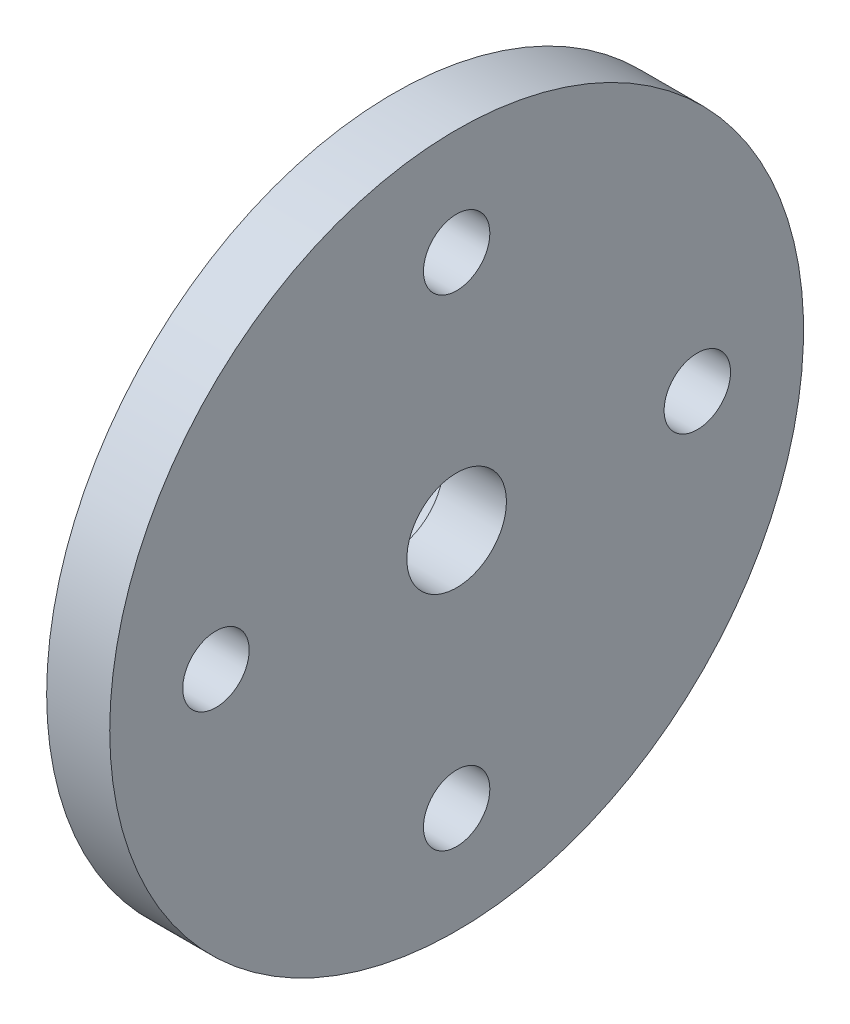
ISO-10303-21;
HEADER;
FILE_DESCRIPTION(('STEP AP214'),'2;1');
FILE_NAME('part.step','',(''),(''),'','','');
FILE_SCHEMA(('AUTOMOTIVE_DESIGN { 1 0 10303 214 1 1 1 1 }'));
ENDSEC;
DATA;
#1=APPLICATION_CONTEXT('core data for automotive mechanical design processes');
#2=APPLICATION_PROTOCOL_DEFINITION('international standard','automotive_design',2000,#1);
#3=PRODUCT_CONTEXT('',#1,'mechanical');
#4=PRODUCT('Part','Part','',(#3));
#5=PRODUCT_RELATED_PRODUCT_CATEGORY('part','',(#4));
#6=PRODUCT_DEFINITION_FORMATION('','',#4);
#7=PRODUCT_DEFINITION_CONTEXT('part definition',#1,'design');
#8=PRODUCT_DEFINITION('design','',#6,#7);
#9=PRODUCT_DEFINITION_SHAPE('','',#8);
#10=(LENGTH_UNIT() NAMED_UNIT(*) SI_UNIT(.MILLI.,.METRE.));
#11=(NAMED_UNIT(*) PLANE_ANGLE_UNIT() SI_UNIT($,.RADIAN.));
#12=(NAMED_UNIT(*) SI_UNIT($,.STERADIAN.) SOLID_ANGLE_UNIT());
#13=UNCERTAINTY_MEASURE_WITH_UNIT(LENGTH_MEASURE(1.E-05),#10,'distance_accuracy_value','');
#14=(GEOMETRIC_REPRESENTATION_CONTEXT(3) GLOBAL_UNCERTAINTY_ASSIGNED_CONTEXT((#13)) GLOBAL_UNIT_ASSIGNED_CONTEXT((#10,
#11,#12)) REPRESENTATION_CONTEXT('',''));
#15=CARTESIAN_POINT('',(0.,0.,0.));
#16=DIRECTION('',(0.,0.,1.));
#17=DIRECTION('',(1.,0.,0.));
#18=AXIS2_PLACEMENT_3D('',#15,#16,#17);
#19=CARTESIAN_POINT('',(0.,0.,0.));
#20=DIRECTION('',(1.,0.,0.));
#21=DIRECTION('',(0.,0.,-1.));
#22=AXIS2_PLACEMENT_3D('',#19,#20,#21);
#23=PLANE('',#22);
#24=CARTESIAN_POINT('',(0.,0.,0.));
#25=DIRECTION('',(1.,0.,0.));
#26=DIRECTION('',(0.,0.,-1.));
#27=AXIS2_PLACEMENT_3D('',#24,#25,#26);
#28=CIRCLE('',#27,4.4);
#29=CARTESIAN_POINT('',(0.,0.,-4.4));
#30=VERTEX_POINT('',#29);
#31=EDGE_CURVE('E35',#30,#30,#28,.T.);
#32=ORIENTED_EDGE('',*,*,#31,.F.);
#33=EDGE_LOOP('',(#32));
#34=FACE_BOUND('',#33,.T.);
#35=CARTESIAN_POINT('',(0.,0.,0.));
#36=DIRECTION('',(1.,0.,0.));
#37=DIRECTION('',(0.,0.,-1.));
#38=AXIS2_PLACEMENT_3D('',#35,#36,#37);
#39=CIRCLE('',#38,3.);
#40=CARTESIAN_POINT('',(0.,0.,-3.));
#41=VERTEX_POINT('',#40);
#42=EDGE_CURVE('E42',#41,#41,#39,.T.);
#43=ORIENTED_EDGE('',*,*,#42,.T.);
#44=EDGE_LOOP('',(#43));
#45=FACE_BOUND('',#44,.T.);
#46=ADVANCED_FACE('F31',(#34,#45),#23,.F.);
#47=CARTESIAN_POINT('',(3.5,0.,0.));
#48=DIRECTION('',(-1.,0.,0.));
#49=DIRECTION('',(0.,0.,1.));
#50=AXIS2_PLACEMENT_3D('',#47,#48,#49);
#51=CYLINDRICAL_SURFACE('',#50,4.4);
#52=CARTESIAN_POINT('',(3.5,0.,0.));
#53=DIRECTION('',(1.,0.,0.));
#54=DIRECTION('',(0.,0.,-1.));
#55=AXIS2_PLACEMENT_3D('',#52,#53,#54);
#56=CIRCLE('',#55,4.4);
#57=CARTESIAN_POINT('',(3.5,0.,-4.4));
#58=VERTEX_POINT('',#57);
#59=EDGE_CURVE('E10',#58,#58,#56,.T.);
#60=ORIENTED_EDGE('',*,*,#59,.F.);
#61=EDGE_LOOP('',(#60));
#62=FACE_BOUND('',#61,.T.);
#63=ORIENTED_EDGE('',*,*,#31,.T.);
#64=EDGE_LOOP('',(#63));
#65=FACE_BOUND('',#64,.T.);
#66=ADVANCED_FACE('F33',(#62,#65),#51,.T.);
#67=CARTESIAN_POINT('',(3.5,0.,0.));
#68=DIRECTION('',(-1.,0.,0.));
#69=DIRECTION('',(0.,0.,1.));
#70=AXIS2_PLACEMENT_3D('',#67,#68,#69);
#71=CYLINDRICAL_SURFACE('',#70,3.);
#72=CARTESIAN_POINT('',(3.5,0.,0.));
#73=DIRECTION('',(1.,0.,0.));
#74=DIRECTION('',(0.,0.,-1.));
#75=AXIS2_PLACEMENT_3D('',#72,#73,#74);
#76=CIRCLE('',#75,3.);
#77=CARTESIAN_POINT('',(3.5,0.,-3.));
#78=VERTEX_POINT('',#77);
#79=EDGE_CURVE('E46',#78,#78,#76,.T.);
#80=ORIENTED_EDGE('',*,*,#79,.T.);
#81=EDGE_LOOP('',(#80));
#82=FACE_BOUND('',#81,.T.);
#83=ORIENTED_EDGE('',*,*,#42,.F.);
#84=EDGE_LOOP('',(#83));
#85=FACE_BOUND('',#84,.T.);
#86=ADVANCED_FACE('F118',(#82,#85),#71,.F.);
#87=CARTESIAN_POINT('',(3.5,0.,0.));
#88=DIRECTION('',(1.,0.,0.));
#89=DIRECTION('',(0.,0.,-1.));
#90=AXIS2_PLACEMENT_3D('',#87,#88,#89);
#91=PLANE('',#90);
#92=CARTESIAN_POINT('',(3.5,0.,0.));
#93=DIRECTION('',(1.,0.,0.));
#94=DIRECTION('',(0.,0.,-1.));
#95=AXIS2_PLACEMENT_3D('',#92,#93,#94);
#96=CIRCLE('',#95,1.5);
#97=CARTESIAN_POINT('',(3.5,0.,-1.5));
#98=VERTEX_POINT('',#97);
#99=EDGE_CURVE('E53',#98,#98,#96,.T.);
#100=ORIENTED_EDGE('',*,*,#99,.T.);
#101=EDGE_LOOP('',(#100));
#102=FACE_BOUND('',#101,.T.);
#103=ORIENTED_EDGE('',*,*,#79,.F.);
#104=EDGE_LOOP('',(#103));
#105=FACE_BOUND('',#104,.T.);
#106=ADVANCED_FACE('F112',(#102,#105),#91,.F.);
#107=CARTESIAN_POINT('',(3.5,-2.06057393370429E-13,7.2499999999998));
#108=DIRECTION('',(1.,0.,0.));
#109=DIRECTION('',(0.,0.,-1.));
#110=AXIS2_PLACEMENT_3D('',#107,#108,#109);
#111=CIRCLE('',#110,1.00000000000033);
#112=CARTESIAN_POINT('',(3.5,-2.06057393370429E-13,6.24999999999947));
#113=VERTEX_POINT('',#112);
#114=EDGE_CURVE('E79',#113,#113,#111,.T.);
#115=ORIENTED_EDGE('',*,*,#114,.T.);
#116=EDGE_LOOP('',(#115));
#117=FACE_BOUND('',#116,.T.);
#118=CARTESIAN_POINT('',(3.5,-7.25,-4.10339048882094E-13));
#119=DIRECTION('',(1.,0.,0.));
#120=DIRECTION('',(0.,0.,-1.));
#121=AXIS2_PLACEMENT_3D('',#118,#119,#120);
#122=CIRCLE('',#121,1.00000000000044);
#123=CARTESIAN_POINT('',(3.5,-7.25,-1.00000000000085));
#124=VERTEX_POINT('',#123);
#125=EDGE_CURVE('E73',#124,#124,#122,.T.);
#126=ORIENTED_EDGE('',*,*,#125,.T.);
#127=EDGE_LOOP('',(#126));
#128=FACE_BOUND('',#127,.T.);
#129=CARTESIAN_POINT('',(3.5,2.05169524441047E-13,-7.25000000000021));
#130=DIRECTION('',(1.,0.,0.));
#131=DIRECTION('',(0.,0.,-1.));
#132=AXIS2_PLACEMENT_3D('',#129,#130,#131);
#133=CIRCLE('',#132,1.00000000000016);
#134=CARTESIAN_POINT('',(3.5,2.05169524441047E-13,-8.25000000000037));
#135=VERTEX_POINT('',#134);
#136=EDGE_CURVE('E67',#135,#135,#133,.T.);
#137=ORIENTED_EDGE('',*,*,#136,.T.);
#138=EDGE_LOOP('',(#137));
#139=FACE_BOUND('',#138,.T.);
#140=CARTESIAN_POINT('',(3.5,7.25,0.));
#141=DIRECTION('',(1.,0.,0.));
#142=DIRECTION('',(0.,0.,-1.));
#143=AXIS2_PLACEMENT_3D('',#140,#141,#142);
#144=CIRCLE('',#143,1.);
#145=CARTESIAN_POINT('',(3.5,7.25,-1.));
#146=VERTEX_POINT('',#145);
#147=EDGE_CURVE('E59',#146,#146,#144,.T.);
#148=ORIENTED_EDGE('',*,*,#147,.T.);
#149=EDGE_LOOP('',(#148));
#150=FACE_BOUND('',#149,.T.);
#151=CARTESIAN_POINT('',(3.5,0.,0.));
#152=DIRECTION('',(1.,0.,0.));
#153=DIRECTION('',(0.,0.,-1.));
#154=AXIS2_PLACEMENT_3D('',#151,#152,#153);
#155=CIRCLE('',#154,10.45);
#156=CARTESIAN_POINT('',(3.5,0.,10.45));
#157=VERTEX_POINT('',#156);
#158=EDGE_CURVE('E50',#157,#157,#155,.T.);
#159=ORIENTED_EDGE('',*,*,#158,.F.);
#160=EDGE_LOOP('',(#159));
#161=FACE_BOUND('',#160,.T.);
#162=ORIENTED_EDGE('',*,*,#59,.T.);
#163=EDGE_LOOP('',(#162));
#164=FACE_BOUND('',#163,.T.);
#165=ADVANCED_FACE('F107',(#117,#128,#139,#150,#161,#164),#91,.F.);
#166=CARTESIAN_POINT('',(5.4,0.,0.));
#167=DIRECTION('',(-1.,0.,0.));
#168=DIRECTION('',(0.,0.,1.));
#169=AXIS2_PLACEMENT_3D('',#166,#167,#168);
#170=CYLINDRICAL_SURFACE('',#169,10.45);
#171=CARTESIAN_POINT('',(5.4,0.,0.));
#172=DIRECTION('',(1.,0.,0.));
#173=DIRECTION('',(0.,0.,-1.));
#174=AXIS2_PLACEMENT_3D('',#171,#172,#173);
#175=CIRCLE('',#174,10.45);
#176=CARTESIAN_POINT('',(5.4,0.,10.45));
#177=VERTEX_POINT('',#176);
#178=EDGE_CURVE('E49',#177,#177,#175,.T.);
#179=CARTESIAN_POINT('',(5.4,0.,10.45));
#180=CARTESIAN_POINT('',(5.38020833333333,0.,10.45));
#181=CARTESIAN_POINT('',(5.36041666666667,0.,10.45));
#182=CARTESIAN_POINT('',(5.32083333333333,0.,10.45));
#183=CARTESIAN_POINT('',(5.30104166666667,0.,10.45));
#184=CARTESIAN_POINT('',(5.26145833333333,0.,10.45));
#185=CARTESIAN_POINT('',(5.24166666666667,0.,10.45));
#186=CARTESIAN_POINT('',(5.20208333333333,0.,10.45));
#187=CARTESIAN_POINT('',(5.18229166666667,0.,10.45));
#188=CARTESIAN_POINT('',(5.14270833333333,0.,10.45));
#189=CARTESIAN_POINT('',(5.12291666666667,0.,10.45));
#190=CARTESIAN_POINT('',(5.08333333333333,0.,10.45));
#191=CARTESIAN_POINT('',(5.06354166666667,0.,10.45));
#192=CARTESIAN_POINT('',(5.02395833333333,0.,10.45));
#193=CARTESIAN_POINT('',(5.00416666666667,0.,10.45));
#194=CARTESIAN_POINT('',(4.96458333333333,0.,10.45));
#195=CARTESIAN_POINT('',(4.94479166666667,0.,10.45));
#196=CARTESIAN_POINT('',(4.90520833333333,0.,10.45));
#197=CARTESIAN_POINT('',(4.88541666666667,0.,10.45));
#198=CARTESIAN_POINT('',(4.84583333333333,0.,10.45));
#199=CARTESIAN_POINT('',(4.82604166666667,0.,10.45));
#200=CARTESIAN_POINT('',(4.78645833333333,0.,10.45));
#201=CARTESIAN_POINT('',(4.76666666666667,0.,10.45));
#202=CARTESIAN_POINT('',(4.72708333333333,0.,10.45));
#203=CARTESIAN_POINT('',(4.70729166666667,0.,10.45));
#204=CARTESIAN_POINT('',(4.66770833333333,0.,10.45));
#205=CARTESIAN_POINT('',(4.64791666666667,0.,10.45));
#206=CARTESIAN_POINT('',(4.60833333333333,0.,10.45));
#207=CARTESIAN_POINT('',(4.58854166666667,0.,10.45));
#208=CARTESIAN_POINT('',(4.54895833333333,0.,10.45));
#209=CARTESIAN_POINT('',(4.52916666666667,0.,10.45));
#210=CARTESIAN_POINT('',(4.48958333333333,0.,10.45));
#211=CARTESIAN_POINT('',(4.46979166666667,0.,10.45));
#212=CARTESIAN_POINT('',(4.43020833333333,0.,10.45));
#213=CARTESIAN_POINT('',(4.41041666666667,0.,10.45));
#214=CARTESIAN_POINT('',(4.37083333333333,0.,10.45));
#215=CARTESIAN_POINT('',(4.35104166666667,0.,10.45));
#216=CARTESIAN_POINT('',(4.31145833333333,0.,10.45));
#217=CARTESIAN_POINT('',(4.29166666666667,0.,10.45));
#218=CARTESIAN_POINT('',(4.25208333333333,0.,10.45));
#219=CARTESIAN_POINT('',(4.23229166666667,0.,10.45));
#220=CARTESIAN_POINT('',(4.19270833333333,0.,10.45));
#221=CARTESIAN_POINT('',(4.17291666666667,0.,10.45));
#222=CARTESIAN_POINT('',(4.13333333333333,0.,10.45));
#223=CARTESIAN_POINT('',(4.11354166666667,0.,10.45));
#224=CARTESIAN_POINT('',(4.07395833333333,0.,10.45));
#225=CARTESIAN_POINT('',(4.05416666666667,0.,10.45));
#226=CARTESIAN_POINT('',(4.01458333333333,0.,10.45));
#227=CARTESIAN_POINT('',(3.99479166666667,0.,10.45));
#228=CARTESIAN_POINT('',(3.95520833333333,0.,10.45));
#229=CARTESIAN_POINT('',(3.93541666666667,0.,10.45));
#230=CARTESIAN_POINT('',(3.89583333333333,0.,10.45));
#231=CARTESIAN_POINT('',(3.87604166666667,0.,10.45));
#232=CARTESIAN_POINT('',(3.83645833333333,0.,10.45));
#233=CARTESIAN_POINT('',(3.81666666666667,0.,10.45));
#234=CARTESIAN_POINT('',(3.77708333333333,0.,10.45));
#235=CARTESIAN_POINT('',(3.75729166666667,0.,10.45));
#236=CARTESIAN_POINT('',(3.71770833333333,0.,10.45));
#237=CARTESIAN_POINT('',(3.69791666666667,0.,10.45));
#238=CARTESIAN_POINT('',(3.65833333333333,0.,10.45));
#239=CARTESIAN_POINT('',(3.63854166666667,0.,10.45));
#240=CARTESIAN_POINT('',(3.59895833333333,0.,10.45));
#241=CARTESIAN_POINT('',(3.57916666666667,0.,10.45));
#242=CARTESIAN_POINT('',(3.53958333333333,0.,10.45));
#243=CARTESIAN_POINT('',(3.51979166666667,0.,10.45));
#244=CARTESIAN_POINT('',(3.5,0.,10.45));
#245=B_SPLINE_CURVE_WITH_KNOTS('',3,(#179,#180,#181,#182,#183,#184,#185,#186,#187,#188,#189,
#190,#191,#192,#193,#194,#195,#196,#197,#198,#199,#200,#201,#202,#203,#204,#205,#206,#207,#208,
#209,#210,#211,#212,#213,#214,#215,#216,#217,#218,#219,#220,#221,#222,#223,#224,#225,#226,#227,
#228,#229,#230,#231,#232,#233,#234,#235,#236,#237,#238,#239,#240,#241,#242,#243,#244),
.UNSPECIFIED.,.F.,.F.,(4,2,2,2,2,2,2,2,2,2,2,2,2,2,2,2,2,2,2,2,2,2,2,2,2,2,2,2,2,2,2,2,4),(0.,
0.0593750000000004,0.118750000000001,0.178125,0.237500000000001,0.296875,0.356250000000001,
0.415625,0.475000000000001,0.534375,0.593750000000001,0.653125,0.7125,0.771875,0.83125,
0.890625000000001,0.95,1.009375,1.06875,1.128125,1.1875,1.246875,1.30625,1.365625,1.425,
1.484375,1.54375,1.603125,1.6625,1.721875,1.78125,1.840625,1.9),.UNSPECIFIED.);
#246=EDGE_CURVE('BSEAM93',#177,#157,#245,.T.);
#247=ORIENTED_EDGE('',*,*,#178,.F.);
#248=ORIENTED_EDGE('',*,*,#158,.T.);
#249=ORIENTED_EDGE('',*,*,#246,.T.);
#250=ORIENTED_EDGE('',*,*,#246,.F.);
#251=EDGE_LOOP('',(#247,#249,#248,#250));
#252=FACE_BOUND('',#251,.T.);
#253=ADVANCED_FACE('F93',(#252),#170,.T.);
#254=CARTESIAN_POINT('',(5.4,0.,0.));
#255=DIRECTION('',(1.,0.,0.));
#256=DIRECTION('',(0.,0.,-1.));
#257=AXIS2_PLACEMENT_3D('',#254,#255,#256);
#258=PLANE('',#257);
#259=CARTESIAN_POINT('',(5.4,-2.06057393370429E-13,7.2499999999998));
#260=DIRECTION('',(1.,0.,0.));
#261=DIRECTION('',(0.,0.,-1.));
#262=AXIS2_PLACEMENT_3D('',#259,#260,#261);
#263=CIRCLE('',#262,1.00000000000033);
#264=CARTESIAN_POINT('',(5.4,-2.06057393370429E-13,6.24999999999947));
#265=VERTEX_POINT('',#264);
#266=EDGE_CURVE('E82',#265,#265,#263,.T.);
#267=ORIENTED_EDGE('',*,*,#266,.F.);
#268=EDGE_LOOP('',(#267));
#269=FACE_BOUND('',#268,.T.);
#270=CARTESIAN_POINT('',(5.4,-7.25,-4.10339048882094E-13));
#271=DIRECTION('',(1.,0.,0.));
#272=DIRECTION('',(0.,0.,-1.));
#273=AXIS2_PLACEMENT_3D('',#270,#271,#272);
#274=CIRCLE('',#273,1.00000000000044);
#275=CARTESIAN_POINT('',(5.4,-7.25,-1.00000000000085));
#276=VERTEX_POINT('',#275);
#277=EDGE_CURVE('E76',#276,#276,#274,.T.);
#278=ORIENTED_EDGE('',*,*,#277,.F.);
#279=EDGE_LOOP('',(#278));
#280=FACE_BOUND('',#279,.T.);
#281=CARTESIAN_POINT('',(5.4,2.05169524441047E-13,-7.25000000000021));
#282=DIRECTION('',(1.,0.,0.));
#283=DIRECTION('',(0.,0.,-1.));
#284=AXIS2_PLACEMENT_3D('',#281,#282,#283);
#285=CIRCLE('',#284,1.00000000000016);
#286=CARTESIAN_POINT('',(5.4,2.05169524441047E-13,-8.25000000000037));
#287=VERTEX_POINT('',#286);
#288=EDGE_CURVE('E70',#287,#287,#285,.T.);
#289=ORIENTED_EDGE('',*,*,#288,.F.);
#290=EDGE_LOOP('',(#289));
#291=FACE_BOUND('',#290,.T.);
#292=CARTESIAN_POINT('',(5.4,7.25,0.));
#293=DIRECTION('',(1.,0.,0.));
#294=DIRECTION('',(0.,0.,-1.));
#295=AXIS2_PLACEMENT_3D('',#292,#293,#294);
#296=CIRCLE('',#295,1.);
#297=CARTESIAN_POINT('',(5.4,7.25,-1.));
#298=VERTEX_POINT('',#297);
#299=EDGE_CURVE('E64',#298,#298,#296,.T.);
#300=ORIENTED_EDGE('',*,*,#299,.F.);
#301=EDGE_LOOP('',(#300));
#302=FACE_BOUND('',#301,.T.);
#303=CARTESIAN_POINT('',(5.4,0.,0.));
#304=DIRECTION('',(1.,0.,0.));
#305=DIRECTION('',(0.,0.,-1.));
#306=AXIS2_PLACEMENT_3D('',#303,#304,#305);
#307=CIRCLE('',#306,1.5);
#308=CARTESIAN_POINT('',(5.4,0.,-1.5));
#309=VERTEX_POINT('',#308);
#310=EDGE_CURVE('E56',#309,#309,#307,.T.);
#311=ORIENTED_EDGE('',*,*,#310,.F.);
#312=EDGE_LOOP('',(#311));
#313=FACE_BOUND('',#312,.T.);
#314=ORIENTED_EDGE('',*,*,#178,.T.);
#315=EDGE_LOOP('',(#314));
#316=FACE_BOUND('',#315,.T.);
#317=ADVANCED_FACE('F89',(#269,#280,#291,#302,#313,#316),#258,.T.);
#318=CARTESIAN_POINT('',(3.5,0.,0.));
#319=DIRECTION('',(1.,0.,0.));
#320=DIRECTION('',(0.,0.,-1.));
#321=AXIS2_PLACEMENT_3D('',#318,#319,#320);
#322=CYLINDRICAL_SURFACE('',#321,1.5);
#323=CARTESIAN_POINT('',(3.5,0.,-1.5));
#324=CARTESIAN_POINT('',(3.51979166666667,0.,-1.5));
#325=CARTESIAN_POINT('',(3.53958333333333,0.,-1.5));
#326=CARTESIAN_POINT('',(3.57916666666667,0.,-1.5));
#327=CARTESIAN_POINT('',(3.59895833333333,0.,-1.5));
#328=CARTESIAN_POINT('',(3.63854166666667,0.,-1.5));
#329=CARTESIAN_POINT('',(3.65833333333333,0.,-1.5));
#330=CARTESIAN_POINT('',(3.69791666666667,0.,-1.5));
#331=CARTESIAN_POINT('',(3.71770833333333,0.,-1.5));
#332=CARTESIAN_POINT('',(3.75729166666667,0.,-1.5));
#333=CARTESIAN_POINT('',(3.77708333333333,0.,-1.5));
#334=CARTESIAN_POINT('',(3.81666666666667,0.,-1.5));
#335=CARTESIAN_POINT('',(3.83645833333333,0.,-1.5));
#336=CARTESIAN_POINT('',(3.87604166666667,0.,-1.5));
#337=CARTESIAN_POINT('',(3.89583333333333,0.,-1.5));
#338=CARTESIAN_POINT('',(3.93541666666667,0.,-1.5));
#339=CARTESIAN_POINT('',(3.95520833333333,0.,-1.5));
#340=CARTESIAN_POINT('',(3.99479166666667,0.,-1.5));
#341=CARTESIAN_POINT('',(4.01458333333333,0.,-1.5));
#342=CARTESIAN_POINT('',(4.05416666666667,0.,-1.5));
#343=CARTESIAN_POINT('',(4.07395833333333,0.,-1.5));
#344=CARTESIAN_POINT('',(4.11354166666667,0.,-1.5));
#345=CARTESIAN_POINT('',(4.13333333333333,0.,-1.5));
#346=CARTESIAN_POINT('',(4.17291666666667,0.,-1.5));
#347=CARTESIAN_POINT('',(4.19270833333333,0.,-1.5));
#348=CARTESIAN_POINT('',(4.23229166666667,0.,-1.5));
#349=CARTESIAN_POINT('',(4.25208333333333,0.,-1.5));
#350=CARTESIAN_POINT('',(4.29166666666667,0.,-1.5));
#351=CARTESIAN_POINT('',(4.31145833333333,0.,-1.5));
#352=CARTESIAN_POINT('',(4.35104166666667,0.,-1.5));
#353=CARTESIAN_POINT('',(4.37083333333333,0.,-1.5));
#354=CARTESIAN_POINT('',(4.41041666666667,0.,-1.5));
#355=CARTESIAN_POINT('',(4.43020833333333,0.,-1.5));
#356=CARTESIAN_POINT('',(4.46979166666667,0.,-1.5));
#357=CARTESIAN_POINT('',(4.48958333333333,0.,-1.5));
#358=CARTESIAN_POINT('',(4.52916666666667,0.,-1.5));
#359=CARTESIAN_POINT('',(4.54895833333333,0.,-1.5));
#360=CARTESIAN_POINT('',(4.58854166666667,0.,-1.5));
#361=CARTESIAN_POINT('',(4.60833333333333,0.,-1.5));
#362=CARTESIAN_POINT('',(4.64791666666667,0.,-1.5));
#363=CARTESIAN_POINT('',(4.66770833333333,0.,-1.5));
#364=CARTESIAN_POINT('',(4.70729166666667,0.,-1.5));
#365=CARTESIAN_POINT('',(4.72708333333333,0.,-1.5));
#366=CARTESIAN_POINT('',(4.76666666666667,0.,-1.5));
#367=CARTESIAN_POINT('',(4.78645833333333,0.,-1.5));
#368=CARTESIAN_POINT('',(4.82604166666667,0.,-1.5));
#369=CARTESIAN_POINT('',(4.84583333333333,0.,-1.5));
#370=CARTESIAN_POINT('',(4.88541666666667,0.,-1.5));
#371=CARTESIAN_POINT('',(4.90520833333333,0.,-1.5));
#372=CARTESIAN_POINT('',(4.94479166666667,0.,-1.5));
#373=CARTESIAN_POINT('',(4.96458333333333,0.,-1.5));
#374=CARTESIAN_POINT('',(5.00416666666667,0.,-1.5));
#375=CARTESIAN_POINT('',(5.02395833333333,0.,-1.5));
#376=CARTESIAN_POINT('',(5.06354166666667,0.,-1.5));
#377=CARTESIAN_POINT('',(5.08333333333333,0.,-1.5));
#378=CARTESIAN_POINT('',(5.12291666666667,0.,-1.5));
#379=CARTESIAN_POINT('',(5.14270833333333,0.,-1.5));
#380=CARTESIAN_POINT('',(5.18229166666667,0.,-1.5));
#381=CARTESIAN_POINT('',(5.20208333333333,0.,-1.5));
#382=CARTESIAN_POINT('',(5.24166666666667,0.,-1.5));
#383=CARTESIAN_POINT('',(5.26145833333333,0.,-1.5));
#384=CARTESIAN_POINT('',(5.30104166666667,0.,-1.5));
#385=CARTESIAN_POINT('',(5.32083333333333,0.,-1.5));
#386=CARTESIAN_POINT('',(5.36041666666667,0.,-1.5));
#387=CARTESIAN_POINT('',(5.38020833333333,0.,-1.5));
#388=CARTESIAN_POINT('',(5.4,0.,-1.5));
#389=B_SPLINE_CURVE_WITH_KNOTS('',3,(#323,#324,#325,#326,#327,#328,#329,#330,#331,#332,#333,
#334,#335,#336,#337,#338,#339,#340,#341,#342,#343,#344,#345,#346,#347,#348,#349,#350,#351,#352,
#353,#354,#355,#356,#357,#358,#359,#360,#361,#362,#363,#364,#365,#366,#367,#368,#369,#370,#371,
#372,#373,#374,#375,#376,#377,#378,#379,#380,#381,#382,#383,#384,#385,#386,#387,#388),
.UNSPECIFIED.,.F.,.F.,(4,2,2,2,2,2,2,2,2,2,2,2,2,2,2,2,2,2,2,2,2,2,2,2,2,2,2,2,2,2,2,2,4),(0.,
0.059375,0.11875,0.178125,0.2375,0.296875,0.35625,0.415624999999999,0.475,0.534374999999999,
0.59375,0.653124999999999,0.7125,0.771874999999999,0.831249999999999,0.890625,0.95,1.009375,
1.06875,1.128125,1.1875,1.246875,1.30625,1.365625,1.425,1.484375,1.54375,1.603125,1.6625,
1.721875,1.78125,1.840625,1.9),.UNSPECIFIED.);
#390=EDGE_CURVE('BSEAM92',#98,#309,#389,.T.);
#391=ORIENTED_EDGE('',*,*,#99,.F.);
#392=ORIENTED_EDGE('',*,*,#310,.T.);
#393=ORIENTED_EDGE('',*,*,#390,.T.);
#394=ORIENTED_EDGE('',*,*,#390,.F.);
#395=EDGE_LOOP('',(#391,#393,#392,#394));
#396=FACE_BOUND('',#395,.T.);
#397=ADVANCED_FACE('F92',(#396),#322,.F.);
#398=CARTESIAN_POINT('',(0.,7.25,0.));
#399=DIRECTION('',(1.,0.,0.));
#400=DIRECTION('',(0.,0.,-1.));
#401=AXIS2_PLACEMENT_3D('',#398,#399,#400);
#402=CYLINDRICAL_SURFACE('',#401,1.);
#403=CARTESIAN_POINT('',(5.4,7.25,-1.));
#404=CARTESIAN_POINT('',(5.38020833333333,7.25,-1.));
#405=CARTESIAN_POINT('',(5.36041666666667,7.25,-1.));
#406=CARTESIAN_POINT('',(5.32083333333333,7.25,-1.));
#407=CARTESIAN_POINT('',(5.30104166666667,7.25,-1.));
#408=CARTESIAN_POINT('',(5.26145833333333,7.25,-1.));
#409=CARTESIAN_POINT('',(5.24166666666667,7.25,-1.));
#410=CARTESIAN_POINT('',(5.20208333333333,7.25,-1.));
#411=CARTESIAN_POINT('',(5.18229166666667,7.25,-1.));
#412=CARTESIAN_POINT('',(5.14270833333333,7.25,-1.));
#413=CARTESIAN_POINT('',(5.12291666666667,7.25,-1.));
#414=CARTESIAN_POINT('',(5.08333333333333,7.25,-1.));
#415=CARTESIAN_POINT('',(5.06354166666667,7.25,-1.));
#416=CARTESIAN_POINT('',(5.02395833333333,7.25,-1.));
#417=CARTESIAN_POINT('',(5.00416666666667,7.25,-1.));
#418=CARTESIAN_POINT('',(4.96458333333333,7.25,-1.));
#419=CARTESIAN_POINT('',(4.94479166666667,7.25,-1.));
#420=CARTESIAN_POINT('',(4.90520833333333,7.25,-1.));
#421=CARTESIAN_POINT('',(4.88541666666667,7.25,-1.));
#422=CARTESIAN_POINT('',(4.84583333333333,7.25,-1.));
#423=CARTESIAN_POINT('',(4.82604166666667,7.25,-1.));
#424=CARTESIAN_POINT('',(4.78645833333333,7.25,-1.));
#425=CARTESIAN_POINT('',(4.76666666666667,7.25,-1.));
#426=CARTESIAN_POINT('',(4.72708333333333,7.25,-1.));
#427=CARTESIAN_POINT('',(4.70729166666667,7.25,-1.));
#428=CARTESIAN_POINT('',(4.66770833333333,7.25,-1.));
#429=CARTESIAN_POINT('',(4.64791666666667,7.25,-1.));
#430=CARTESIAN_POINT('',(4.60833333333333,7.25,-1.));
#431=CARTESIAN_POINT('',(4.58854166666667,7.25,-1.));
#432=CARTESIAN_POINT('',(4.54895833333333,7.25,-1.));
#433=CARTESIAN_POINT('',(4.52916666666667,7.25,-1.));
#434=CARTESIAN_POINT('',(4.48958333333333,7.25,-1.));
#435=CARTESIAN_POINT('',(4.46979166666667,7.25,-1.));
#436=CARTESIAN_POINT('',(4.43020833333333,7.25,-1.));
#437=CARTESIAN_POINT('',(4.41041666666667,7.25,-1.));
#438=CARTESIAN_POINT('',(4.37083333333333,7.25,-1.));
#439=CARTESIAN_POINT('',(4.35104166666667,7.25,-1.));
#440=CARTESIAN_POINT('',(4.31145833333333,7.25,-1.));
#441=CARTESIAN_POINT('',(4.29166666666667,7.25,-1.));
#442=CARTESIAN_POINT('',(4.25208333333333,7.25,-1.));
#443=CARTESIAN_POINT('',(4.23229166666667,7.25,-1.));
#444=CARTESIAN_POINT('',(4.19270833333333,7.25,-1.));
#445=CARTESIAN_POINT('',(4.17291666666667,7.25,-1.));
#446=CARTESIAN_POINT('',(4.13333333333333,7.25,-1.));
#447=CARTESIAN_POINT('',(4.11354166666667,7.25,-1.));
#448=CARTESIAN_POINT('',(4.07395833333333,7.25,-1.));
#449=CARTESIAN_POINT('',(4.05416666666667,7.25,-1.));
#450=CARTESIAN_POINT('',(4.01458333333333,7.25,-1.));
#451=CARTESIAN_POINT('',(3.99479166666667,7.25,-1.));
#452=CARTESIAN_POINT('',(3.95520833333333,7.25,-1.));
#453=CARTESIAN_POINT('',(3.93541666666667,7.25,-1.));
#454=CARTESIAN_POINT('',(3.89583333333333,7.25,-1.));
#455=CARTESIAN_POINT('',(3.87604166666667,7.25,-1.));
#456=CARTESIAN_POINT('',(3.83645833333333,7.25,-1.));
#457=CARTESIAN_POINT('',(3.81666666666667,7.25,-1.));
#458=CARTESIAN_POINT('',(3.77708333333333,7.25,-1.));
#459=CARTESIAN_POINT('',(3.75729166666667,7.25,-1.));
#460=CARTESIAN_POINT('',(3.71770833333333,7.25,-1.));
#461=CARTESIAN_POINT('',(3.69791666666667,7.25,-1.));
#462=CARTESIAN_POINT('',(3.65833333333333,7.25,-1.));
#463=CARTESIAN_POINT('',(3.63854166666667,7.25,-1.));
#464=CARTESIAN_POINT('',(3.59895833333333,7.25,-1.));
#465=CARTESIAN_POINT('',(3.57916666666667,7.25,-1.));
#466=CARTESIAN_POINT('',(3.53958333333333,7.25,-1.));
#467=CARTESIAN_POINT('',(3.51979166666667,7.25,-1.));
#468=CARTESIAN_POINT('',(3.5,7.25,-1.));
#469=B_SPLINE_CURVE_WITH_KNOTS('',3,(#403,#404,#405,#406,#407,#408,#409,#410,#411,#412,#413,
#414,#415,#416,#417,#418,#419,#420,#421,#422,#423,#424,#425,#426,#427,#428,#429,#430,#431,#432,
#433,#434,#435,#436,#437,#438,#439,#440,#441,#442,#443,#444,#445,#446,#447,#448,#449,#450,#451,
#452,#453,#454,#455,#456,#457,#458,#459,#460,#461,#462,#463,#464,#465,#466,#467,#468),
.UNSPECIFIED.,.F.,.F.,(4,2,2,2,2,2,2,2,2,2,2,2,2,2,2,2,2,2,2,2,2,2,2,2,2,2,2,2,2,2,2,2,4),(0.,
0.0593750000000004,0.11875,0.178125,0.2375,0.296875,0.35625,0.415625,0.475,0.534375,0.59375,
0.653125,0.7125,0.771875,0.83125,0.890625,0.95,1.009375,1.06875,1.128125,1.1875,1.246875,
1.30625,1.365625,1.425,1.484375,1.54375,1.603125,1.6625,1.721875,1.78125,1.840625,1.9),.UNSPECIFIED.);
#470=EDGE_CURVE('BSEAM156',#298,#146,#469,.T.);
#471=ORIENTED_EDGE('',*,*,#299,.T.);
#472=ORIENTED_EDGE('',*,*,#147,.F.);
#473=ORIENTED_EDGE('',*,*,#470,.T.);
#474=ORIENTED_EDGE('',*,*,#470,.F.);
#475=EDGE_LOOP('',(#471,#473,#472,#474));
#476=FACE_BOUND('',#475,.T.);
#477=ADVANCED_FACE('F156',(#476),#402,.F.);
#478=CARTESIAN_POINT('',(0.,2.05169524441047E-13,-7.25000000000021));
#479=DIRECTION('',(1.,0.,0.));
#480=DIRECTION('',(0.,0.,-1.));
#481=AXIS2_PLACEMENT_3D('',#478,#479,#480);
#482=CYLINDRICAL_SURFACE('',#481,1.00000000000016);
#483=CARTESIAN_POINT('',(5.4,2.05169524441047E-13,-8.25000000000037));
#484=CARTESIAN_POINT('',(5.38020833333333,2.05169524441047E-13,-8.25000000000037));
#485=CARTESIAN_POINT('',(5.36041666666667,2.05169524441047E-13,-8.25000000000037));
#486=CARTESIAN_POINT('',(5.32083333333333,2.05169524441047E-13,-8.25000000000037));
#487=CARTESIAN_POINT('',(5.30104166666667,2.05169524441047E-13,-8.25000000000037));
#488=CARTESIAN_POINT('',(5.26145833333333,2.05169524441047E-13,-8.25000000000037));
#489=CARTESIAN_POINT('',(5.24166666666667,2.05169524441047E-13,-8.25000000000037));
#490=CARTESIAN_POINT('',(5.20208333333333,2.05169524441047E-13,-8.25000000000037));
#491=CARTESIAN_POINT('',(5.18229166666667,2.05169524441047E-13,-8.25000000000037));
#492=CARTESIAN_POINT('',(5.14270833333333,2.05169524441047E-13,-8.25000000000037));
#493=CARTESIAN_POINT('',(5.12291666666667,2.05169524441047E-13,-8.25000000000037));
#494=CARTESIAN_POINT('',(5.08333333333333,2.05169524441047E-13,-8.25000000000037));
#495=CARTESIAN_POINT('',(5.06354166666667,2.05169524441047E-13,-8.25000000000037));
#496=CARTESIAN_POINT('',(5.02395833333333,2.05169524441047E-13,-8.25000000000037));
#497=CARTESIAN_POINT('',(5.00416666666667,2.05169524441047E-13,-8.25000000000037));
#498=CARTESIAN_POINT('',(4.96458333333333,2.05169524441047E-13,-8.25000000000037));
#499=CARTESIAN_POINT('',(4.94479166666667,2.05169524441047E-13,-8.25000000000037));
#500=CARTESIAN_POINT('',(4.90520833333333,2.05169524441047E-13,-8.25000000000037));
#501=CARTESIAN_POINT('',(4.88541666666667,2.05169524441047E-13,-8.25000000000037));
#502=CARTESIAN_POINT('',(4.84583333333333,2.05169524441047E-13,-8.25000000000037));
#503=CARTESIAN_POINT('',(4.82604166666667,2.05169524441047E-13,-8.25000000000037));
#504=CARTESIAN_POINT('',(4.78645833333333,2.05169524441047E-13,-8.25000000000037));
#505=CARTESIAN_POINT('',(4.76666666666667,2.05169524441047E-13,-8.25000000000037));
#506=CARTESIAN_POINT('',(4.72708333333333,2.05169524441047E-13,-8.25000000000037));
#507=CARTESIAN_POINT('',(4.70729166666667,2.05169524441047E-13,-8.25000000000037));
#508=CARTESIAN_POINT('',(4.66770833333333,2.05169524441047E-13,-8.25000000000037));
#509=CARTESIAN_POINT('',(4.64791666666667,2.05169524441047E-13,-8.25000000000037));
#510=CARTESIAN_POINT('',(4.60833333333333,2.05169524441047E-13,-8.25000000000037));
#511=CARTESIAN_POINT('',(4.58854166666667,2.05169524441047E-13,-8.25000000000037));
#512=CARTESIAN_POINT('',(4.54895833333333,2.05169524441047E-13,-8.25000000000037));
#513=CARTESIAN_POINT('',(4.52916666666667,2.05169524441047E-13,-8.25000000000037));
#514=CARTESIAN_POINT('',(4.48958333333333,2.05169524441047E-13,-8.25000000000037));
#515=CARTESIAN_POINT('',(4.46979166666667,2.05169524441047E-13,-8.25000000000037));
#516=CARTESIAN_POINT('',(4.43020833333333,2.05169524441047E-13,-8.25000000000037));
#517=CARTESIAN_POINT('',(4.41041666666667,2.05169524441047E-13,-8.25000000000037));
#518=CARTESIAN_POINT('',(4.37083333333333,2.05169524441047E-13,-8.25000000000037));
#519=CARTESIAN_POINT('',(4.35104166666667,2.05169524441047E-13,-8.25000000000037));
#520=CARTESIAN_POINT('',(4.31145833333333,2.05169524441047E-13,-8.25000000000037));
#521=CARTESIAN_POINT('',(4.29166666666667,2.05169524441047E-13,-8.25000000000037));
#522=CARTESIAN_POINT('',(4.25208333333333,2.05169524441047E-13,-8.25000000000037));
#523=CARTESIAN_POINT('',(4.23229166666667,2.05169524441047E-13,-8.25000000000037));
#524=CARTESIAN_POINT('',(4.19270833333333,2.05169524441047E-13,-8.25000000000037));
#525=CARTESIAN_POINT('',(4.17291666666667,2.05169524441047E-13,-8.25000000000037));
#526=CARTESIAN_POINT('',(4.13333333333333,2.05169524441047E-13,-8.25000000000037));
#527=CARTESIAN_POINT('',(4.11354166666667,2.05169524441047E-13,-8.25000000000037));
#528=CARTESIAN_POINT('',(4.07395833333333,2.05169524441047E-13,-8.25000000000037));
#529=CARTESIAN_POINT('',(4.05416666666667,2.05169524441047E-13,-8.25000000000037));
#530=CARTESIAN_POINT('',(4.01458333333333,2.05169524441047E-13,-8.25000000000037));
#531=CARTESIAN_POINT('',(3.99479166666667,2.05169524441047E-13,-8.25000000000037));
#532=CARTESIAN_POINT('',(3.95520833333333,2.05169524441047E-13,-8.25000000000037));
#533=CARTESIAN_POINT('',(3.93541666666667,2.05169524441047E-13,-8.25000000000037));
#534=CARTESIAN_POINT('',(3.89583333333333,2.05169524441047E-13,-8.25000000000037));
#535=CARTESIAN_POINT('',(3.87604166666667,2.05169524441047E-13,-8.25000000000037));
#536=CARTESIAN_POINT('',(3.83645833333333,2.05169524441047E-13,-8.25000000000037));
#537=CARTESIAN_POINT('',(3.81666666666667,2.05169524441047E-13,-8.25000000000037));
#538=CARTESIAN_POINT('',(3.77708333333333,2.05169524441047E-13,-8.25000000000037));
#539=CARTESIAN_POINT('',(3.75729166666667,2.05169524441047E-13,-8.25000000000037));
#540=CARTESIAN_POINT('',(3.71770833333333,2.05169524441047E-13,-8.25000000000037));
#541=CARTESIAN_POINT('',(3.69791666666667,2.05169524441047E-13,-8.25000000000037));
#542=CARTESIAN_POINT('',(3.65833333333333,2.05169524441047E-13,-8.25000000000037));
#543=CARTESIAN_POINT('',(3.63854166666667,2.05169524441047E-13,-8.25000000000037));
#544=CARTESIAN_POINT('',(3.59895833333333,2.05169524441047E-13,-8.25000000000037));
#545=CARTESIAN_POINT('',(3.57916666666667,2.05169524441047E-13,-8.25000000000037));
#546=CARTESIAN_POINT('',(3.53958333333333,2.05169524441047E-13,-8.25000000000037));
#547=CARTESIAN_POINT('',(3.51979166666667,2.05169524441047E-13,-8.25000000000037));
#548=CARTESIAN_POINT('',(3.5,2.05169524441047E-13,-8.25000000000037));
#549=B_SPLINE_CURVE_WITH_KNOTS('',3,(#483,#484,#485,#486,#487,#488,#489,#490,#491,#492,#493,
#494,#495,#496,#497,#498,#499,#500,#501,#502,#503,#504,#505,#506,#507,#508,#509,#510,#511,#512,
#513,#514,#515,#516,#517,#518,#519,#520,#521,#522,#523,#524,#525,#526,#527,#528,#529,#530,#531,
#532,#533,#534,#535,#536,#537,#538,#539,#540,#541,#542,#543,#544,#545,#546,#547,#548),
.UNSPECIFIED.,.F.,.F.,(4,2,2,2,2,2,2,2,2,2,2,2,2,2,2,2,2,2,2,2,2,2,2,2,2,2,2,2,2,2,2,2,4),(0.,
0.0593750000000004,0.11875,0.178125,0.2375,0.296875,0.35625,0.415625,0.475,0.534375,0.59375,
0.653125,0.7125,0.771875,0.83125,0.890625,0.95,1.009375,1.06875,1.128125,1.1875,1.246875,
1.30625,1.365625,1.425,1.484375,1.54375,1.603125,1.6625,1.721875,1.78125,1.840625,1.9),.UNSPECIFIED.);
#550=EDGE_CURVE('BSEAM176',#287,#135,#549,.T.);
#551=ORIENTED_EDGE('',*,*,#288,.T.);
#552=ORIENTED_EDGE('',*,*,#136,.F.);
#553=ORIENTED_EDGE('',*,*,#550,.T.);
#554=ORIENTED_EDGE('',*,*,#550,.F.);
#555=EDGE_LOOP('',(#551,#553,#552,#554));
#556=FACE_BOUND('',#555,.T.);
#557=ADVANCED_FACE('F176',(#556),#482,.F.);
#558=CARTESIAN_POINT('',(0.,-7.25,-4.10339048882094E-13));
#559=DIRECTION('',(1.,0.,0.));
#560=DIRECTION('',(0.,0.,-1.));
#561=AXIS2_PLACEMENT_3D('',#558,#559,#560);
#562=CYLINDRICAL_SURFACE('',#561,1.00000000000044);
#563=CARTESIAN_POINT('',(5.4,-7.25,-1.00000000000085));
#564=CARTESIAN_POINT('',(5.38020833333333,-7.25,-1.00000000000085));
#565=CARTESIAN_POINT('',(5.36041666666667,-7.25,-1.00000000000085));
#566=CARTESIAN_POINT('',(5.32083333333333,-7.25,-1.00000000000085));
#567=CARTESIAN_POINT('',(5.30104166666667,-7.25,-1.00000000000085));
#568=CARTESIAN_POINT('',(5.26145833333333,-7.25,-1.00000000000085));
#569=CARTESIAN_POINT('',(5.24166666666667,-7.25,-1.00000000000085));
#570=CARTESIAN_POINT('',(5.20208333333333,-7.25,-1.00000000000085));
#571=CARTESIAN_POINT('',(5.18229166666667,-7.25,-1.00000000000085));
#572=CARTESIAN_POINT('',(5.14270833333333,-7.25,-1.00000000000085));
#573=CARTESIAN_POINT('',(5.12291666666667,-7.25,-1.00000000000085));
#574=CARTESIAN_POINT('',(5.08333333333333,-7.25,-1.00000000000085));
#575=CARTESIAN_POINT('',(5.06354166666667,-7.25,-1.00000000000085));
#576=CARTESIAN_POINT('',(5.02395833333333,-7.25,-1.00000000000085));
#577=CARTESIAN_POINT('',(5.00416666666667,-7.25,-1.00000000000085));
#578=CARTESIAN_POINT('',(4.96458333333333,-7.25,-1.00000000000085));
#579=CARTESIAN_POINT('',(4.94479166666667,-7.25,-1.00000000000085));
#580=CARTESIAN_POINT('',(4.90520833333333,-7.25,-1.00000000000085));
#581=CARTESIAN_POINT('',(4.88541666666667,-7.25,-1.00000000000085));
#582=CARTESIAN_POINT('',(4.84583333333333,-7.25,-1.00000000000085));
#583=CARTESIAN_POINT('',(4.82604166666667,-7.25,-1.00000000000085));
#584=CARTESIAN_POINT('',(4.78645833333333,-7.25,-1.00000000000085));
#585=CARTESIAN_POINT('',(4.76666666666667,-7.25,-1.00000000000085));
#586=CARTESIAN_POINT('',(4.72708333333333,-7.25,-1.00000000000085));
#587=CARTESIAN_POINT('',(4.70729166666667,-7.25,-1.00000000000085));
#588=CARTESIAN_POINT('',(4.66770833333333,-7.25,-1.00000000000085));
#589=CARTESIAN_POINT('',(4.64791666666667,-7.25,-1.00000000000085));
#590=CARTESIAN_POINT('',(4.60833333333333,-7.25,-1.00000000000085));
#591=CARTESIAN_POINT('',(4.58854166666667,-7.25,-1.00000000000085));
#592=CARTESIAN_POINT('',(4.54895833333333,-7.25,-1.00000000000085));
#593=CARTESIAN_POINT('',(4.52916666666667,-7.25,-1.00000000000085));
#594=CARTESIAN_POINT('',(4.48958333333333,-7.25,-1.00000000000085));
#595=CARTESIAN_POINT('',(4.46979166666667,-7.25,-1.00000000000085));
#596=CARTESIAN_POINT('',(4.43020833333333,-7.25,-1.00000000000085));
#597=CARTESIAN_POINT('',(4.41041666666667,-7.25,-1.00000000000085));
#598=CARTESIAN_POINT('',(4.37083333333333,-7.25,-1.00000000000085));
#599=CARTESIAN_POINT('',(4.35104166666667,-7.25,-1.00000000000085));
#600=CARTESIAN_POINT('',(4.31145833333333,-7.25,-1.00000000000085));
#601=CARTESIAN_POINT('',(4.29166666666667,-7.25,-1.00000000000085));
#602=CARTESIAN_POINT('',(4.25208333333333,-7.25,-1.00000000000085));
#603=CARTESIAN_POINT('',(4.23229166666667,-7.25,-1.00000000000085));
#604=CARTESIAN_POINT('',(4.19270833333333,-7.25,-1.00000000000085));
#605=CARTESIAN_POINT('',(4.17291666666667,-7.25,-1.00000000000085));
#606=CARTESIAN_POINT('',(4.13333333333333,-7.25,-1.00000000000085));
#607=CARTESIAN_POINT('',(4.11354166666667,-7.25,-1.00000000000085));
#608=CARTESIAN_POINT('',(4.07395833333333,-7.25,-1.00000000000085));
#609=CARTESIAN_POINT('',(4.05416666666667,-7.25,-1.00000000000085));
#610=CARTESIAN_POINT('',(4.01458333333333,-7.25,-1.00000000000085));
#611=CARTESIAN_POINT('',(3.99479166666667,-7.25,-1.00000000000085));
#612=CARTESIAN_POINT('',(3.95520833333333,-7.25,-1.00000000000085));
#613=CARTESIAN_POINT('',(3.93541666666667,-7.25,-1.00000000000085));
#614=CARTESIAN_POINT('',(3.89583333333333,-7.25,-1.00000000000085));
#615=CARTESIAN_POINT('',(3.87604166666667,-7.25,-1.00000000000085));
#616=CARTESIAN_POINT('',(3.83645833333333,-7.25,-1.00000000000085));
#617=CARTESIAN_POINT('',(3.81666666666667,-7.25,-1.00000000000085));
#618=CARTESIAN_POINT('',(3.77708333333333,-7.25,-1.00000000000085));
#619=CARTESIAN_POINT('',(3.75729166666667,-7.25,-1.00000000000085));
#620=CARTESIAN_POINT('',(3.71770833333333,-7.25,-1.00000000000085));
#621=CARTESIAN_POINT('',(3.69791666666667,-7.25,-1.00000000000085));
#622=CARTESIAN_POINT('',(3.65833333333333,-7.25,-1.00000000000085));
#623=CARTESIAN_POINT('',(3.63854166666667,-7.25,-1.00000000000085));
#624=CARTESIAN_POINT('',(3.59895833333333,-7.25,-1.00000000000085));
#625=CARTESIAN_POINT('',(3.57916666666667,-7.25,-1.00000000000085));
#626=CARTESIAN_POINT('',(3.53958333333333,-7.25,-1.00000000000085));
#627=CARTESIAN_POINT('',(3.51979166666667,-7.25,-1.00000000000085));
#628=CARTESIAN_POINT('',(3.5,-7.25,-1.00000000000085));
#629=B_SPLINE_CURVE_WITH_KNOTS('',3,(#563,#564,#565,#566,#567,#568,#569,#570,#571,#572,#573,
#574,#575,#576,#577,#578,#579,#580,#581,#582,#583,#584,#585,#586,#587,#588,#589,#590,#591,#592,
#593,#594,#595,#596,#597,#598,#599,#600,#601,#602,#603,#604,#605,#606,#607,#608,#609,#610,#611,
#612,#613,#614,#615,#616,#617,#618,#619,#620,#621,#622,#623,#624,#625,#626,#627,#628),
.UNSPECIFIED.,.F.,.F.,(4,2,2,2,2,2,2,2,2,2,2,2,2,2,2,2,2,2,2,2,2,2,2,2,2,2,2,2,2,2,2,2,4),(0.,
0.0593750000000004,0.11875,0.178125,0.2375,0.296875,0.35625,0.415625,0.475,0.534375,0.59375,
0.653125,0.7125,0.771875,0.83125,0.890625,0.95,1.009375,1.06875,1.128125,1.1875,1.246875,
1.30625,1.365625,1.425,1.484375,1.54375,1.603125,1.6625,1.721875,1.78125,1.840625,1.9),.UNSPECIFIED.);
#630=EDGE_CURVE('BSEAM186',#276,#124,#629,.T.);
#631=ORIENTED_EDGE('',*,*,#277,.T.);
#632=ORIENTED_EDGE('',*,*,#125,.F.);
#633=ORIENTED_EDGE('',*,*,#630,.T.);
#634=ORIENTED_EDGE('',*,*,#630,.F.);
#635=EDGE_LOOP('',(#631,#633,#632,#634));
#636=FACE_BOUND('',#635,.T.);
#637=ADVANCED_FACE('F186',(#636),#562,.F.);
#638=CARTESIAN_POINT('',(0.,-2.06057393370429E-13,7.2499999999998));
#639=DIRECTION('',(1.,0.,0.));
#640=DIRECTION('',(0.,0.,-1.));
#641=AXIS2_PLACEMENT_3D('',#638,#639,#640);
#642=CYLINDRICAL_SURFACE('',#641,1.00000000000033);
#643=CARTESIAN_POINT('',(5.4,-2.06057393370429E-13,6.24999999999947));
#644=CARTESIAN_POINT('',(5.38020833333333,-2.06057393370429E-13,6.24999999999947));
#645=CARTESIAN_POINT('',(5.36041666666667,-2.06057393370429E-13,6.24999999999947));
#646=CARTESIAN_POINT('',(5.32083333333333,-2.06057393370429E-13,6.24999999999947));
#647=CARTESIAN_POINT('',(5.30104166666667,-2.06057393370429E-13,6.24999999999947));
#648=CARTESIAN_POINT('',(5.26145833333333,-2.06057393370429E-13,6.24999999999947));
#649=CARTESIAN_POINT('',(5.24166666666667,-2.06057393370429E-13,6.24999999999947));
#650=CARTESIAN_POINT('',(5.20208333333333,-2.06057393370429E-13,6.24999999999947));
#651=CARTESIAN_POINT('',(5.18229166666667,-2.06057393370429E-13,6.24999999999947));
#652=CARTESIAN_POINT('',(5.14270833333333,-2.06057393370429E-13,6.24999999999947));
#653=CARTESIAN_POINT('',(5.12291666666667,-2.06057393370429E-13,6.24999999999947));
#654=CARTESIAN_POINT('',(5.08333333333333,-2.06057393370429E-13,6.24999999999947));
#655=CARTESIAN_POINT('',(5.06354166666667,-2.06057393370429E-13,6.24999999999947));
#656=CARTESIAN_POINT('',(5.02395833333333,-2.06057393370429E-13,6.24999999999947));
#657=CARTESIAN_POINT('',(5.00416666666667,-2.06057393370429E-13,6.24999999999947));
#658=CARTESIAN_POINT('',(4.96458333333333,-2.06057393370429E-13,6.24999999999947));
#659=CARTESIAN_POINT('',(4.94479166666667,-2.06057393370429E-13,6.24999999999947));
#660=CARTESIAN_POINT('',(4.90520833333333,-2.06057393370429E-13,6.24999999999947));
#661=CARTESIAN_POINT('',(4.88541666666667,-2.06057393370429E-13,6.24999999999947));
#662=CARTESIAN_POINT('',(4.84583333333333,-2.06057393370429E-13,6.24999999999947));
#663=CARTESIAN_POINT('',(4.82604166666667,-2.06057393370429E-13,6.24999999999947));
#664=CARTESIAN_POINT('',(4.78645833333333,-2.06057393370429E-13,6.24999999999947));
#665=CARTESIAN_POINT('',(4.76666666666667,-2.06057393370429E-13,6.24999999999947));
#666=CARTESIAN_POINT('',(4.72708333333333,-2.06057393370429E-13,6.24999999999947));
#667=CARTESIAN_POINT('',(4.70729166666667,-2.06057393370429E-13,6.24999999999947));
#668=CARTESIAN_POINT('',(4.66770833333333,-2.06057393370429E-13,6.24999999999947));
#669=CARTESIAN_POINT('',(4.64791666666667,-2.06057393370429E-13,6.24999999999947));
#670=CARTESIAN_POINT('',(4.60833333333333,-2.06057393370429E-13,6.24999999999947));
#671=CARTESIAN_POINT('',(4.58854166666667,-2.06057393370429E-13,6.24999999999947));
#672=CARTESIAN_POINT('',(4.54895833333333,-2.06057393370429E-13,6.24999999999947));
#673=CARTESIAN_POINT('',(4.52916666666667,-2.06057393370429E-13,6.24999999999947));
#674=CARTESIAN_POINT('',(4.48958333333333,-2.06057393370429E-13,6.24999999999947));
#675=CARTESIAN_POINT('',(4.46979166666667,-2.06057393370429E-13,6.24999999999947));
#676=CARTESIAN_POINT('',(4.43020833333333,-2.06057393370429E-13,6.24999999999947));
#677=CARTESIAN_POINT('',(4.41041666666667,-2.06057393370429E-13,6.24999999999947));
#678=CARTESIAN_POINT('',(4.37083333333333,-2.06057393370429E-13,6.24999999999947));
#679=CARTESIAN_POINT('',(4.35104166666667,-2.06057393370429E-13,6.24999999999947));
#680=CARTESIAN_POINT('',(4.31145833333333,-2.06057393370429E-13,6.24999999999947));
#681=CARTESIAN_POINT('',(4.29166666666667,-2.06057393370429E-13,6.24999999999947));
#682=CARTESIAN_POINT('',(4.25208333333333,-2.06057393370429E-13,6.24999999999947));
#683=CARTESIAN_POINT('',(4.23229166666667,-2.06057393370429E-13,6.24999999999947));
#684=CARTESIAN_POINT('',(4.19270833333333,-2.06057393370429E-13,6.24999999999947));
#685=CARTESIAN_POINT('',(4.17291666666667,-2.06057393370429E-13,6.24999999999947));
#686=CARTESIAN_POINT('',(4.13333333333333,-2.06057393370429E-13,6.24999999999947));
#687=CARTESIAN_POINT('',(4.11354166666667,-2.06057393370429E-13,6.24999999999947));
#688=CARTESIAN_POINT('',(4.07395833333333,-2.06057393370429E-13,6.24999999999947));
#689=CARTESIAN_POINT('',(4.05416666666667,-2.06057393370429E-13,6.24999999999947));
#690=CARTESIAN_POINT('',(4.01458333333333,-2.06057393370429E-13,6.24999999999947));
#691=CARTESIAN_POINT('',(3.99479166666667,-2.06057393370429E-13,6.24999999999947));
#692=CARTESIAN_POINT('',(3.95520833333333,-2.06057393370429E-13,6.24999999999947));
#693=CARTESIAN_POINT('',(3.93541666666667,-2.06057393370429E-13,6.24999999999947));
#694=CARTESIAN_POINT('',(3.89583333333333,-2.06057393370429E-13,6.24999999999947));
#695=CARTESIAN_POINT('',(3.87604166666667,-2.06057393370429E-13,6.24999999999947));
#696=CARTESIAN_POINT('',(3.83645833333333,-2.06057393370429E-13,6.24999999999947));
#697=CARTESIAN_POINT('',(3.81666666666667,-2.06057393370429E-13,6.24999999999947));
#698=CARTESIAN_POINT('',(3.77708333333333,-2.06057393370429E-13,6.24999999999947));
#699=CARTESIAN_POINT('',(3.75729166666667,-2.06057393370429E-13,6.24999999999947));
#700=CARTESIAN_POINT('',(3.71770833333333,-2.06057393370429E-13,6.24999999999947));
#701=CARTESIAN_POINT('',(3.69791666666667,-2.06057393370429E-13,6.24999999999947));
#702=CARTESIAN_POINT('',(3.65833333333333,-2.06057393370429E-13,6.24999999999947));
#703=CARTESIAN_POINT('',(3.63854166666667,-2.06057393370429E-13,6.24999999999947));
#704=CARTESIAN_POINT('',(3.59895833333333,-2.06057393370429E-13,6.24999999999947));
#705=CARTESIAN_POINT('',(3.57916666666667,-2.06057393370429E-13,6.24999999999947));
#706=CARTESIAN_POINT('',(3.53958333333333,-2.06057393370429E-13,6.24999999999947));
#707=CARTESIAN_POINT('',(3.51979166666667,-2.06057393370429E-13,6.24999999999947));
#708=CARTESIAN_POINT('',(3.5,-2.06057393370429E-13,6.24999999999947));
#709=B_SPLINE_CURVE_WITH_KNOTS('',3,(#643,#644,#645,#646,#647,#648,#649,#650,#651,#652,#653,
#654,#655,#656,#657,#658,#659,#660,#661,#662,#663,#664,#665,#666,#667,#668,#669,#670,#671,#672,
#673,#674,#675,#676,#677,#678,#679,#680,#681,#682,#683,#684,#685,#686,#687,#688,#689,#690,#691,
#692,#693,#694,#695,#696,#697,#698,#699,#700,#701,#702,#703,#704,#705,#706,#707,#708),
.UNSPECIFIED.,.F.,.F.,(4,2,2,2,2,2,2,2,2,2,2,2,2,2,2,2,2,2,2,2,2,2,2,2,2,2,2,2,2,2,2,2,4),(0.,
0.0593750000000004,0.11875,0.178125,0.2375,0.296875,0.35625,0.415625,0.475,0.534375,0.59375,
0.653125,0.7125,0.771875,0.83125,0.890625,0.95,1.009375,1.06875,1.128125,1.1875,1.246875,
1.30625,1.365625,1.425,1.484375,1.54375,1.603125,1.6625,1.721875,1.78125,1.840625,1.9),.UNSPECIFIED.);
#710=EDGE_CURVE('BSEAM86',#265,#113,#709,.T.);
#711=ORIENTED_EDGE('',*,*,#266,.T.);
#712=ORIENTED_EDGE('',*,*,#114,.F.);
#713=ORIENTED_EDGE('',*,*,#710,.T.);
#714=ORIENTED_EDGE('',*,*,#710,.F.);
#715=EDGE_LOOP('',(#711,#713,#712,#714));
#716=FACE_BOUND('',#715,.T.);
#717=ADVANCED_FACE('F86',(#716),#642,.F.);
#718=CLOSED_SHELL('',(#46,#66,#86,#106,#165,#253,#317,#397,#477,#557,#637,#717));
#719=MANIFOLD_SOLID_BREP('B2',#718);
#720=ADVANCED_BREP_SHAPE_REPRESENTATION('',(#18,#719),#14);
#721=SHAPE_DEFINITION_REPRESENTATION(#9,#720);
ENDSEC;
END-ISO-10303-21;
